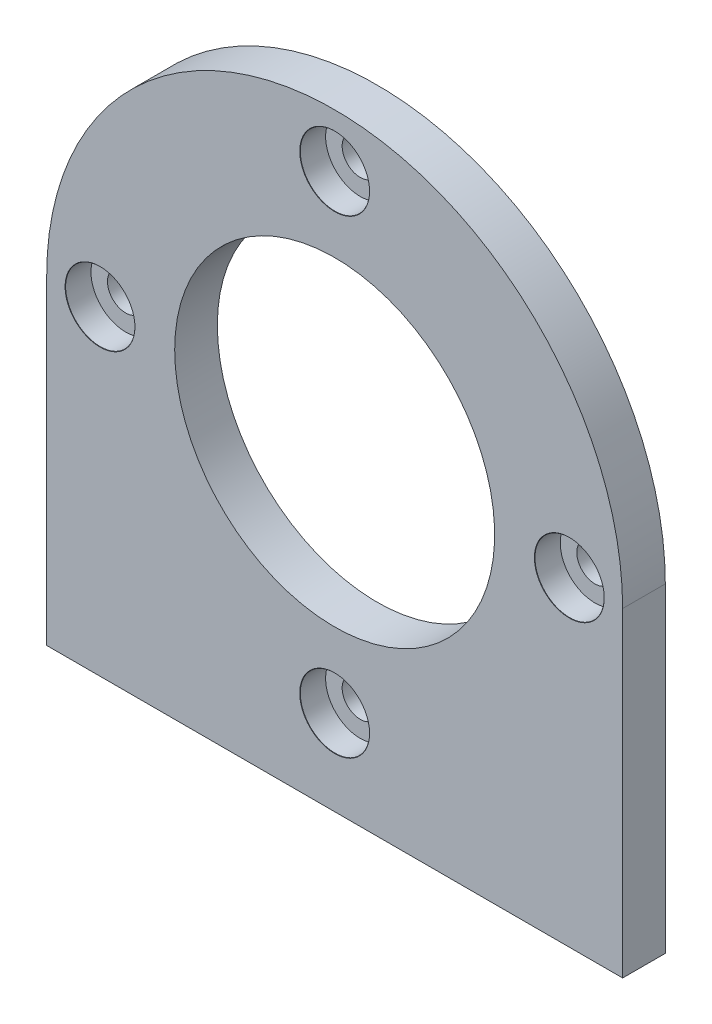
ISO-10303-21;
HEADER;
FILE_DESCRIPTION(('STEP AP214'),'2;1');
FILE_NAME('part.step','',(''),(''),'','','');
FILE_SCHEMA(('AUTOMOTIVE_DESIGN { 1 0 10303 214 1 1 1 1 }'));
ENDSEC;
DATA;
#1=APPLICATION_CONTEXT('core data for automotive mechanical design processes');
#2=APPLICATION_PROTOCOL_DEFINITION('international standard','automotive_design',2000,#1);
#3=PRODUCT_CONTEXT('',#1,'mechanical');
#4=PRODUCT('Part','Part','',(#3));
#5=PRODUCT_RELATED_PRODUCT_CATEGORY('part','',(#4));
#6=PRODUCT_DEFINITION_FORMATION('','',#4);
#7=PRODUCT_DEFINITION_CONTEXT('part definition',#1,'design');
#8=PRODUCT_DEFINITION('design','',#6,#7);
#9=PRODUCT_DEFINITION_SHAPE('','',#8);
#10=(LENGTH_UNIT() NAMED_UNIT(*) SI_UNIT(.MILLI.,.METRE.));
#11=(NAMED_UNIT(*) PLANE_ANGLE_UNIT() SI_UNIT($,.RADIAN.));
#12=(NAMED_UNIT(*) SI_UNIT($,.STERADIAN.) SOLID_ANGLE_UNIT());
#13=UNCERTAINTY_MEASURE_WITH_UNIT(LENGTH_MEASURE(1.E-05),#10,'distance_accuracy_value','');
#14=(GEOMETRIC_REPRESENTATION_CONTEXT(3) GLOBAL_UNCERTAINTY_ASSIGNED_CONTEXT((#13)) GLOBAL_UNIT_ASSIGNED_CONTEXT((#10,
#11,#12)) REPRESENTATION_CONTEXT('',''));
#15=CARTESIAN_POINT('',(0.,0.,0.));
#16=DIRECTION('',(0.,0.,1.));
#17=DIRECTION('',(1.,0.,0.));
#18=AXIS2_PLACEMENT_3D('',#15,#16,#17);
#19=CARTESIAN_POINT('',(0.,0.,4.));
#20=DIRECTION('',(0.,0.,-1.));
#21=DIRECTION('',(-1.,0.,0.));
#22=AXIS2_PLACEMENT_3D('',#19,#20,#21);
#23=CYLINDRICAL_SURFACE('',#22,27.);
#24=CARTESIAN_POINT('',(0.,0.,4.));
#25=DIRECTION('',(0.,0.,1.));
#26=DIRECTION('',(1.,0.,0.));
#27=AXIS2_PLACEMENT_3D('',#24,#25,#26);
#28=CIRCLE('',#27,27.);
#29=CARTESIAN_POINT('',(27.,0.,4.));
#30=VERTEX_POINT('',#29);
#31=CARTESIAN_POINT('',(-27.,0.,4.));
#32=VERTEX_POINT('',#31);
#33=EDGE_CURVE('E11',#30,#32,#28,.T.);
#34=ORIENTED_EDGE('',*,*,#33,.F.);
#35=DIRECTION('',(0.,0.,1.));
#36=VECTOR('',#35,1.);
#37=CARTESIAN_POINT('',(27.,0.,-61.773780845922));
#38=LINE('',#37,#36);
#39=CARTESIAN_POINT('',(27.,0.,0.));
#40=VERTEX_POINT('',#39);
#41=EDGE_CURVE('E120',#40,#30,#38,.T.);
#42=ORIENTED_EDGE('',*,*,#41,.F.);
#43=CARTESIAN_POINT('',(0.,0.,0.));
#44=DIRECTION('',(0.,0.,1.));
#45=DIRECTION('',(1.,0.,0.));
#46=AXIS2_PLACEMENT_3D('',#43,#44,#45);
#47=CIRCLE('',#46,27.);
#48=CARTESIAN_POINT('',(-27.,0.,0.));
#49=VERTEX_POINT('',#48);
#50=EDGE_CURVE('E48',#40,#49,#47,.T.);
#51=ORIENTED_EDGE('',*,*,#50,.T.);
#52=DIRECTION('',(0.,0.,1.));
#53=VECTOR('',#52,1.);
#54=CARTESIAN_POINT('',(-27.,0.,-61.773780845922));
#55=LINE('',#54,#53);
#56=EDGE_CURVE('E60',#49,#32,#55,.T.);
#57=ORIENTED_EDGE('',*,*,#56,.T.);
#58=EDGE_LOOP('',(#34,#42,#51,#57));
#59=FACE_BOUND('',#58,.T.);
#60=ADVANCED_FACE('F45',(#59),#23,.T.);
#61=CARTESIAN_POINT('',(0.,0.,4.));
#62=DIRECTION('',(0.,0.,1.));
#63=DIRECTION('',(1.,0.,0.));
#64=AXIS2_PLACEMENT_3D('',#61,#62,#63);
#65=PLANE('',#64);
#66=CARTESIAN_POINT('',(0.,0.,4.));
#67=DIRECTION('',(0.,0.,-1.));
#68=DIRECTION('',(-1.,0.,0.));
#69=AXIS2_PLACEMENT_3D('',#66,#67,#68);
#70=CIRCLE('',#69,15.);
#71=CARTESIAN_POINT('',(-15.,0.,4.));
#72=VERTEX_POINT('',#71);
#73=EDGE_CURVE('E108',#72,#72,#70,.T.);
#74=ORIENTED_EDGE('',*,*,#73,.T.);
#75=EDGE_LOOP('',(#74));
#76=FACE_BOUND('',#75,.T.);
#77=CARTESIAN_POINT('',(0.,22.,4.));
#78=DIRECTION('',(0.,0.,1.));
#79=DIRECTION('',(1.,0.,0.));
#80=AXIS2_PLACEMENT_3D('',#77,#78,#79);
#81=CIRCLE('',#80,3.275);
#82=CARTESIAN_POINT('',(3.275,22.,4.));
#83=VERTEX_POINT('',#82);
#84=EDGE_CURVE('E130',#83,#83,#81,.T.);
#85=ORIENTED_EDGE('',*,*,#84,.F.);
#86=EDGE_LOOP('',(#85));
#87=FACE_BOUND('',#86,.T.);
#88=CARTESIAN_POINT('',(22.0000000000006,6.21236273031702E-13,4.));
#89=DIRECTION('',(0.,0.,1.));
#90=DIRECTION('',(1.,0.,0.));
#91=AXIS2_PLACEMENT_3D('',#88,#89,#90);
#92=CIRCLE('',#91,3.275);
#93=CARTESIAN_POINT('',(25.2750000000006,6.21236273031702E-13,4.));
#94=VERTEX_POINT('',#93);
#95=EDGE_CURVE('E150',#94,#94,#92,.T.);
#96=ORIENTED_EDGE('',*,*,#95,.F.);
#97=EDGE_LOOP('',(#96));
#98=FACE_BOUND('',#97,.T.);
#99=CARTESIAN_POINT('',(1.2424725460634E-12,-22.,4.));
#100=DIRECTION('',(0.,0.,1.));
#101=DIRECTION('',(1.,0.,0.));
#102=AXIS2_PLACEMENT_3D('',#99,#100,#101);
#103=CIRCLE('',#102,3.275);
#104=CARTESIAN_POINT('',(3.27500000000124,-22.,4.));
#105=VERTEX_POINT('',#104);
#106=EDGE_CURVE('E170',#105,#105,#103,.T.);
#107=ORIENTED_EDGE('',*,*,#106,.F.);
#108=EDGE_LOOP('',(#107));
#109=FACE_BOUND('',#108,.T.);
#110=CARTESIAN_POINT('',(-21.9999999999994,-6.18542050073578E-13,4.));
#111=DIRECTION('',(0.,0.,1.));
#112=DIRECTION('',(1.,0.,0.));
#113=AXIS2_PLACEMENT_3D('',#110,#111,#112);
#114=CIRCLE('',#113,3.275);
#115=CARTESIAN_POINT('',(-18.7249999999994,-6.18542050073578E-13,4.));
#116=VERTEX_POINT('',#115);
#117=EDGE_CURVE('E190',#116,#116,#114,.T.);
#118=ORIENTED_EDGE('',*,*,#117,.F.);
#119=EDGE_LOOP('',(#118));
#120=FACE_BOUND('',#119,.T.);
#121=ORIENTED_EDGE('',*,*,#33,.T.);
#122=DIRECTION('',(0.,-1.,0.));
#123=VECTOR('',#122,1.);
#124=CARTESIAN_POINT('',(-27.,0.,4.));
#125=LINE('',#124,#123);
#126=CARTESIAN_POINT('',(-27.,-30.,4.));
#127=VERTEX_POINT('',#126);
#128=EDGE_CURVE('E88',#32,#127,#125,.T.);
#129=ORIENTED_EDGE('',*,*,#128,.T.);
#130=DIRECTION('',(1.,0.,0.));
#131=VECTOR('',#130,1.);
#132=CARTESIAN_POINT('',(-27.,-30.,4.));
#133=LINE('',#132,#131);
#134=CARTESIAN_POINT('',(27.,-30.,4.));
#135=VERTEX_POINT('',#134);
#136=EDGE_CURVE('E97',#127,#135,#133,.T.);
#137=ORIENTED_EDGE('',*,*,#136,.T.);
#138=DIRECTION('',(0.,1.,0.));
#139=VECTOR('',#138,1.);
#140=CARTESIAN_POINT('',(27.,-30.,4.));
#141=LINE('',#140,#139);
#142=EDGE_CURVE('E104',#135,#30,#141,.T.);
#143=ORIENTED_EDGE('',*,*,#142,.T.);
#144=EDGE_LOOP('',(#121,#129,#137,#143));
#145=FACE_BOUND('',#144,.T.);
#146=ADVANCED_FACE('F106',(#76,#87,#98,#109,#120,#145),#65,.T.);
#147=CARTESIAN_POINT('',(0.,0.,0.));
#148=DIRECTION('',(0.,0.,1.));
#149=DIRECTION('',(1.,0.,0.));
#150=AXIS2_PLACEMENT_3D('',#147,#148,#149);
#151=PLANE('',#150);
#152=CARTESIAN_POINT('',(0.,0.,0.));
#153=DIRECTION('',(0.,0.,-1.));
#154=DIRECTION('',(-1.,0.,0.));
#155=AXIS2_PLACEMENT_3D('',#152,#153,#154);
#156=CIRCLE('',#155,15.);
#157=CARTESIAN_POINT('',(-15.,0.,0.));
#158=VERTEX_POINT('',#157);
#159=EDGE_CURVE('E112',#158,#158,#156,.T.);
#160=ORIENTED_EDGE('',*,*,#159,.F.);
#161=EDGE_LOOP('',(#160));
#162=FACE_BOUND('',#161,.T.);
#163=CARTESIAN_POINT('',(0.,22.,0.));
#164=DIRECTION('',(0.,0.,1.));
#165=DIRECTION('',(1.,0.,0.));
#166=AXIS2_PLACEMENT_3D('',#163,#164,#165);
#167=CIRCLE('',#166,1.7);
#168=CARTESIAN_POINT('',(1.7,22.,0.));
#169=VERTEX_POINT('',#168);
#170=EDGE_CURVE('E146',#169,#169,#167,.T.);
#171=ORIENTED_EDGE('',*,*,#170,.T.);
#172=EDGE_LOOP('',(#171));
#173=FACE_BOUND('',#172,.T.);
#174=CARTESIAN_POINT('',(22.0000000000006,6.21236273031702E-13,0.));
#175=DIRECTION('',(0.,0.,1.));
#176=DIRECTION('',(1.,0.,0.));
#177=AXIS2_PLACEMENT_3D('',#174,#175,#176);
#178=CIRCLE('',#177,1.7);
#179=CARTESIAN_POINT('',(23.7000000000006,6.21236273031702E-13,0.));
#180=VERTEX_POINT('',#179);
#181=EDGE_CURVE('E166',#180,#180,#178,.T.);
#182=ORIENTED_EDGE('',*,*,#181,.T.);
#183=EDGE_LOOP('',(#182));
#184=FACE_BOUND('',#183,.T.);
#185=CARTESIAN_POINT('',(1.2424725460634E-12,-22.,0.));
#186=DIRECTION('',(0.,0.,1.));
#187=DIRECTION('',(1.,0.,0.));
#188=AXIS2_PLACEMENT_3D('',#185,#186,#187);
#189=CIRCLE('',#188,1.7);
#190=CARTESIAN_POINT('',(1.70000000000124,-22.,0.));
#191=VERTEX_POINT('',#190);
#192=EDGE_CURVE('E186',#191,#191,#189,.T.);
#193=ORIENTED_EDGE('',*,*,#192,.T.);
#194=EDGE_LOOP('',(#193));
#195=FACE_BOUND('',#194,.T.);
#196=CARTESIAN_POINT('',(-21.9999999999994,-6.18542050073578E-13,0.));
#197=DIRECTION('',(0.,0.,1.));
#198=DIRECTION('',(1.,0.,0.));
#199=AXIS2_PLACEMENT_3D('',#196,#197,#198);
#200=CIRCLE('',#199,1.7);
#201=CARTESIAN_POINT('',(-20.2999999999994,-6.18542050073578E-13,0.));
#202=VERTEX_POINT('',#201);
#203=EDGE_CURVE('E206',#202,#202,#200,.T.);
#204=ORIENTED_EDGE('',*,*,#203,.T.);
#205=EDGE_LOOP('',(#204));
#206=FACE_BOUND('',#205,.T.);
#207=ORIENTED_EDGE('',*,*,#50,.F.);
#208=DIRECTION('',(0.,-1.,0.));
#209=VECTOR('',#208,1.);
#210=CARTESIAN_POINT('',(27.,-30.,0.));
#211=LINE('',#210,#209);
#212=CARTESIAN_POINT('',(27.,-30.,0.));
#213=VERTEX_POINT('',#212);
#214=EDGE_CURVE('E115',#40,#213,#211,.T.);
#215=ORIENTED_EDGE('',*,*,#214,.T.);
#216=DIRECTION('',(-1.,0.,0.));
#217=VECTOR('',#216,1.);
#218=CARTESIAN_POINT('',(-27.,-30.,0.));
#219=LINE('',#218,#217);
#220=CARTESIAN_POINT('',(-27.,-30.,0.));
#221=VERTEX_POINT('',#220);
#222=EDGE_CURVE('E123',#213,#221,#219,.T.);
#223=ORIENTED_EDGE('',*,*,#222,.T.);
#224=DIRECTION('',(0.,1.,0.));
#225=VECTOR('',#224,1.);
#226=CARTESIAN_POINT('',(-27.,0.,0.));
#227=LINE('',#226,#225);
#228=EDGE_CURVE('E90',#221,#49,#227,.T.);
#229=ORIENTED_EDGE('',*,*,#228,.T.);
#230=EDGE_LOOP('',(#207,#215,#223,#229));
#231=FACE_BOUND('',#230,.T.);
#232=ADVANCED_FACE('F214',(#162,#173,#184,#195,#206,#231),#151,.F.);
#233=CARTESIAN_POINT('',(-21.9999999999994,-6.18542050073578E-13,4.));
#234=DIRECTION('',(0.,0.,1.));
#235=DIRECTION('',(1.,0.,0.));
#236=AXIS2_PLACEMENT_3D('',#233,#234,#235);
#237=CYLINDRICAL_SURFACE('',#236,1.7);
#238=ORIENTED_EDGE('',*,*,#203,.F.);
#239=EDGE_LOOP('',(#238));
#240=FACE_BOUND('',#239,.T.);
#241=CARTESIAN_POINT('',(-21.9999999999994,-6.18542050073578E-13,1.6));
#242=DIRECTION('',(0.,0.,1.));
#243=DIRECTION('',(1.,0.,0.));
#244=AXIS2_PLACEMENT_3D('',#241,#242,#243);
#245=CIRCLE('',#244,1.7);
#246=CARTESIAN_POINT('',(-20.2999999999994,-6.18542050073578E-13,1.6));
#247=VERTEX_POINT('',#246);
#248=EDGE_CURVE('E202',#247,#247,#245,.T.);
#249=ORIENTED_EDGE('',*,*,#248,.T.);
#250=EDGE_LOOP('',(#249));
#251=FACE_BOUND('',#250,.T.);
#252=ADVANCED_FACE('F226',(#240,#251),#237,.F.);
#253=CARTESIAN_POINT('',(-18.7499999999994,-6.18542050073578E-13,1.6));
#254=DIRECTION('',(0.,0.,-1.));
#255=DIRECTION('',(-1.,0.,0.));
#256=AXIS2_PLACEMENT_3D('',#253,#254,#255);
#257=PLANE('',#256);
#258=ORIENTED_EDGE('',*,*,#248,.F.);
#259=EDGE_LOOP('',(#258));
#260=FACE_BOUND('',#259,.T.);
#261=CARTESIAN_POINT('',(-21.9999999999994,-6.18542050073578E-13,1.6));
#262=DIRECTION('',(0.,0.,1.));
#263=DIRECTION('',(1.,0.,0.));
#264=AXIS2_PLACEMENT_3D('',#261,#262,#263);
#265=CIRCLE('',#264,3.25);
#266=CARTESIAN_POINT('',(-18.7499999999994,-6.18542050073578E-13,1.6));
#267=VERTEX_POINT('',#266);
#268=EDGE_CURVE('E198',#267,#267,#265,.T.);
#269=ORIENTED_EDGE('',*,*,#268,.T.);
#270=EDGE_LOOP('',(#269));
#271=FACE_BOUND('',#270,.T.);
#272=ADVANCED_FACE('F272',(#260,#271),#257,.F.);
#273=CARTESIAN_POINT('',(-21.9999999999994,-6.18542050073578E-13,4.));
#274=DIRECTION('',(0.,0.,1.));
#275=DIRECTION('',(1.,0.,0.));
#276=AXIS2_PLACEMENT_3D('',#273,#274,#275);
#277=CYLINDRICAL_SURFACE('',#276,3.25);
#278=ORIENTED_EDGE('',*,*,#268,.F.);
#279=EDGE_LOOP('',(#278));
#280=FACE_BOUND('',#279,.T.);
#281=CARTESIAN_POINT('',(-21.9999999999994,-6.18542050073578E-13,3.975));
#282=DIRECTION('',(0.,0.,1.));
#283=DIRECTION('',(1.,0.,0.));
#284=AXIS2_PLACEMENT_3D('',#281,#282,#283);
#285=CIRCLE('',#284,3.25);
#286=CARTESIAN_POINT('',(-18.7499999999994,-6.18542050073578E-13,3.975));
#287=VERTEX_POINT('',#286);
#288=EDGE_CURVE('E194',#287,#287,#285,.T.);
#289=ORIENTED_EDGE('',*,*,#288,.T.);
#290=EDGE_LOOP('',(#289));
#291=FACE_BOUND('',#290,.T.);
#292=ADVANCED_FACE('F266',(#280,#291),#277,.F.);
#293=CARTESIAN_POINT('',(-21.9999999999994,-6.18542050073578E-13,4.));
#294=DIRECTION('',(0.,0.,1.));
#295=DIRECTION('',(1.,0.,0.));
#296=AXIS2_PLACEMENT_3D('',#293,#294,#295);
#297=CONICAL_SURFACE('',#296,3.275,0.785398163397448);
#298=ORIENTED_EDGE('',*,*,#288,.F.);
#299=EDGE_LOOP('',(#298));
#300=FACE_BOUND('',#299,.T.);
#301=ORIENTED_EDGE('',*,*,#117,.T.);
#302=EDGE_LOOP('',(#301));
#303=FACE_BOUND('',#302,.T.);
#304=ADVANCED_FACE('F237',(#300,#303),#297,.F.);
#305=CARTESIAN_POINT('',(1.2424725460634E-12,-22.,4.));
#306=DIRECTION('',(0.,0.,1.));
#307=DIRECTION('',(1.,0.,0.));
#308=AXIS2_PLACEMENT_3D('',#305,#306,#307);
#309=CYLINDRICAL_SURFACE('',#308,1.7);
#310=ORIENTED_EDGE('',*,*,#192,.F.);
#311=EDGE_LOOP('',(#310));
#312=FACE_BOUND('',#311,.T.);
#313=CARTESIAN_POINT('',(1.2424725460634E-12,-22.,1.6));
#314=DIRECTION('',(0.,0.,1.));
#315=DIRECTION('',(1.,0.,0.));
#316=AXIS2_PLACEMENT_3D('',#313,#314,#315);
#317=CIRCLE('',#316,1.7);
#318=CARTESIAN_POINT('',(1.70000000000124,-22.,1.6));
#319=VERTEX_POINT('',#318);
#320=EDGE_CURVE('E182',#319,#319,#317,.T.);
#321=ORIENTED_EDGE('',*,*,#320,.T.);
#322=EDGE_LOOP('',(#321));
#323=FACE_BOUND('',#322,.T.);
#324=ADVANCED_FACE('F233',(#312,#323),#309,.F.);
#325=CARTESIAN_POINT('',(3.25000000000124,-22.,1.6));
#326=DIRECTION('',(0.,0.,-1.));
#327=DIRECTION('',(-1.,0.,0.));
#328=AXIS2_PLACEMENT_3D('',#325,#326,#327);
#329=PLANE('',#328);
#330=ORIENTED_EDGE('',*,*,#320,.F.);
#331=EDGE_LOOP('',(#330));
#332=FACE_BOUND('',#331,.T.);
#333=CARTESIAN_POINT('',(1.2424725460634E-12,-22.,1.6));
#334=DIRECTION('',(0.,0.,1.));
#335=DIRECTION('',(1.,0.,0.));
#336=AXIS2_PLACEMENT_3D('',#333,#334,#335);
#337=CIRCLE('',#336,3.25);
#338=CARTESIAN_POINT('',(3.25000000000124,-22.,1.6));
#339=VERTEX_POINT('',#338);
#340=EDGE_CURVE('E178',#339,#339,#337,.T.);
#341=ORIENTED_EDGE('',*,*,#340,.T.);
#342=EDGE_LOOP('',(#341));
#343=FACE_BOUND('',#342,.T.);
#344=ADVANCED_FACE('F236',(#332,#343),#329,.F.);
#345=CARTESIAN_POINT('',(1.2424725460634E-12,-22.,4.));
#346=DIRECTION('',(0.,0.,1.));
#347=DIRECTION('',(1.,0.,0.));
#348=AXIS2_PLACEMENT_3D('',#345,#346,#347);
#349=CYLINDRICAL_SURFACE('',#348,3.25);
#350=ORIENTED_EDGE('',*,*,#340,.F.);
#351=EDGE_LOOP('',(#350));
#352=FACE_BOUND('',#351,.T.);
#353=CARTESIAN_POINT('',(1.2424725460634E-12,-22.,3.975));
#354=DIRECTION('',(0.,0.,1.));
#355=DIRECTION('',(1.,0.,0.));
#356=AXIS2_PLACEMENT_3D('',#353,#354,#355);
#357=CIRCLE('',#356,3.25);
#358=CARTESIAN_POINT('',(3.25000000000124,-22.,3.975));
#359=VERTEX_POINT('',#358);
#360=EDGE_CURVE('E174',#359,#359,#357,.T.);
#361=ORIENTED_EDGE('',*,*,#360,.T.);
#362=EDGE_LOOP('',(#361));
#363=FACE_BOUND('',#362,.T.);
#364=ADVANCED_FACE('F243',(#352,#363),#349,.F.);
#365=CARTESIAN_POINT('',(1.2424725460634E-12,-22.,4.));
#366=DIRECTION('',(0.,0.,1.));
#367=DIRECTION('',(1.,0.,0.));
#368=AXIS2_PLACEMENT_3D('',#365,#366,#367);
#369=CONICAL_SURFACE('',#368,3.275,0.785398163397448);
#370=ORIENTED_EDGE('',*,*,#360,.F.);
#371=EDGE_LOOP('',(#370));
#372=FACE_BOUND('',#371,.T.);
#373=ORIENTED_EDGE('',*,*,#106,.T.);
#374=EDGE_LOOP('',(#373));
#375=FACE_BOUND('',#374,.T.);
#376=ADVANCED_FACE('F249',(#372,#375),#369,.F.);
#377=CARTESIAN_POINT('',(22.0000000000006,6.21236273031702E-13,4.));
#378=DIRECTION('',(0.,0.,1.));
#379=DIRECTION('',(1.,0.,0.));
#380=AXIS2_PLACEMENT_3D('',#377,#378,#379);
#381=CYLINDRICAL_SURFACE('',#380,1.7);
#382=ORIENTED_EDGE('',*,*,#181,.F.);
#383=EDGE_LOOP('',(#382));
#384=FACE_BOUND('',#383,.T.);
#385=CARTESIAN_POINT('',(22.0000000000006,6.21236273031702E-13,1.6));
#386=DIRECTION('',(0.,0.,1.));
#387=DIRECTION('',(1.,0.,0.));
#388=AXIS2_PLACEMENT_3D('',#385,#386,#387);
#389=CIRCLE('',#388,1.7);
#390=CARTESIAN_POINT('',(23.7000000000006,6.21236273031702E-13,1.6));
#391=VERTEX_POINT('',#390);
#392=EDGE_CURVE('E162',#391,#391,#389,.T.);
#393=ORIENTED_EDGE('',*,*,#392,.T.);
#394=EDGE_LOOP('',(#393));
#395=FACE_BOUND('',#394,.T.);
#396=ADVANCED_FACE('F255',(#384,#395),#381,.F.);
#397=CARTESIAN_POINT('',(25.2500000000006,6.21236273031702E-13,1.6));
#398=DIRECTION('',(0.,0.,-1.));
#399=DIRECTION('',(-1.,0.,0.));
#400=AXIS2_PLACEMENT_3D('',#397,#398,#399);
#401=PLANE('',#400);
#402=ORIENTED_EDGE('',*,*,#392,.F.);
#403=EDGE_LOOP('',(#402));
#404=FACE_BOUND('',#403,.T.);
#405=CARTESIAN_POINT('',(22.0000000000006,6.21236273031702E-13,1.6));
#406=DIRECTION('',(0.,0.,1.));
#407=DIRECTION('',(1.,0.,0.));
#408=AXIS2_PLACEMENT_3D('',#405,#406,#407);
#409=CIRCLE('',#408,3.25);
#410=CARTESIAN_POINT('',(25.2500000000006,6.21236273031702E-13,1.6));
#411=VERTEX_POINT('',#410);
#412=EDGE_CURVE('E158',#411,#411,#409,.T.);
#413=ORIENTED_EDGE('',*,*,#412,.T.);
#414=EDGE_LOOP('',(#413));
#415=FACE_BOUND('',#414,.T.);
#416=ADVANCED_FACE('F379',(#404,#415),#401,.F.);
#417=CARTESIAN_POINT('',(22.0000000000006,6.21236273031702E-13,4.));
#418=DIRECTION('',(0.,0.,1.));
#419=DIRECTION('',(1.,0.,0.));
#420=AXIS2_PLACEMENT_3D('',#417,#418,#419);
#421=CYLINDRICAL_SURFACE('',#420,3.25);
#422=ORIENTED_EDGE('',*,*,#412,.F.);
#423=EDGE_LOOP('',(#422));
#424=FACE_BOUND('',#423,.T.);
#425=CARTESIAN_POINT('',(22.0000000000006,6.21236273031702E-13,3.975));
#426=DIRECTION('',(0.,0.,1.));
#427=DIRECTION('',(1.,0.,0.));
#428=AXIS2_PLACEMENT_3D('',#425,#426,#427);
#429=CIRCLE('',#428,3.25);
#430=CARTESIAN_POINT('',(25.2500000000006,6.21236273031702E-13,3.975));
#431=VERTEX_POINT('',#430);
#432=EDGE_CURVE('E154',#431,#431,#429,.T.);
#433=ORIENTED_EDGE('',*,*,#432,.T.);
#434=EDGE_LOOP('',(#433));
#435=FACE_BOUND('',#434,.T.);
#436=ADVANCED_FACE('F370',(#424,#435),#421,.F.);
#437=CARTESIAN_POINT('',(22.0000000000006,6.21236273031702E-13,4.));
#438=DIRECTION('',(0.,0.,1.));
#439=DIRECTION('',(1.,0.,0.));
#440=AXIS2_PLACEMENT_3D('',#437,#438,#439);
#441=CONICAL_SURFACE('',#440,3.275,0.785398163397448);
#442=ORIENTED_EDGE('',*,*,#432,.F.);
#443=EDGE_LOOP('',(#442));
#444=FACE_BOUND('',#443,.T.);
#445=ORIENTED_EDGE('',*,*,#95,.T.);
#446=EDGE_LOOP('',(#445));
#447=FACE_BOUND('',#446,.T.);
#448=ADVANCED_FACE('F361',(#444,#447),#441,.F.);
#449=CARTESIAN_POINT('',(0.,22.,4.));
#450=DIRECTION('',(0.,0.,1.));
#451=DIRECTION('',(1.,0.,0.));
#452=AXIS2_PLACEMENT_3D('',#449,#450,#451);
#453=CYLINDRICAL_SURFACE('',#452,1.7);
#454=ORIENTED_EDGE('',*,*,#170,.F.);
#455=EDGE_LOOP('',(#454));
#456=FACE_BOUND('',#455,.T.);
#457=CARTESIAN_POINT('',(0.,22.,1.6));
#458=DIRECTION('',(0.,0.,1.));
#459=DIRECTION('',(1.,0.,0.));
#460=AXIS2_PLACEMENT_3D('',#457,#458,#459);
#461=CIRCLE('',#460,1.7);
#462=CARTESIAN_POINT('',(1.7,22.,1.6));
#463=VERTEX_POINT('',#462);
#464=EDGE_CURVE('E142',#463,#463,#461,.T.);
#465=ORIENTED_EDGE('',*,*,#464,.T.);
#466=EDGE_LOOP('',(#465));
#467=FACE_BOUND('',#466,.T.);
#468=ADVANCED_FACE('F352',(#456,#467),#453,.F.);
#469=CARTESIAN_POINT('',(3.25,22.,1.6));
#470=DIRECTION('',(0.,0.,-1.));
#471=DIRECTION('',(-1.,0.,0.));
#472=AXIS2_PLACEMENT_3D('',#469,#470,#471);
#473=PLANE('',#472);
#474=ORIENTED_EDGE('',*,*,#464,.F.);
#475=EDGE_LOOP('',(#474));
#476=FACE_BOUND('',#475,.T.);
#477=CARTESIAN_POINT('',(0.,22.,1.6));
#478=DIRECTION('',(0.,0.,1.));
#479=DIRECTION('',(1.,0.,0.));
#480=AXIS2_PLACEMENT_3D('',#477,#478,#479);
#481=CIRCLE('',#480,3.25);
#482=CARTESIAN_POINT('',(3.25,22.,1.6));
#483=VERTEX_POINT('',#482);
#484=EDGE_CURVE('E138',#483,#483,#481,.T.);
#485=ORIENTED_EDGE('',*,*,#484,.T.);
#486=EDGE_LOOP('',(#485));
#487=FACE_BOUND('',#486,.T.);
#488=ADVANCED_FACE('F343',(#476,#487),#473,.F.);
#489=CARTESIAN_POINT('',(0.,22.,4.));
#490=DIRECTION('',(0.,0.,1.));
#491=DIRECTION('',(1.,0.,0.));
#492=AXIS2_PLACEMENT_3D('',#489,#490,#491);
#493=CYLINDRICAL_SURFACE('',#492,3.25);
#494=ORIENTED_EDGE('',*,*,#484,.F.);
#495=EDGE_LOOP('',(#494));
#496=FACE_BOUND('',#495,.T.);
#497=CARTESIAN_POINT('',(0.,22.,3.975));
#498=DIRECTION('',(0.,0.,1.));
#499=DIRECTION('',(1.,0.,0.));
#500=AXIS2_PLACEMENT_3D('',#497,#498,#499);
#501=CIRCLE('',#500,3.25);
#502=CARTESIAN_POINT('',(3.25,22.,3.975));
#503=VERTEX_POINT('',#502);
#504=EDGE_CURVE('E134',#503,#503,#501,.T.);
#505=ORIENTED_EDGE('',*,*,#504,.T.);
#506=EDGE_LOOP('',(#505));
#507=FACE_BOUND('',#506,.T.);
#508=ADVANCED_FACE('F335',(#496,#507),#493,.F.);
#509=CARTESIAN_POINT('',(0.,22.,4.));
#510=DIRECTION('',(0.,0.,1.));
#511=DIRECTION('',(1.,0.,0.));
#512=AXIS2_PLACEMENT_3D('',#509,#510,#511);
#513=CONICAL_SURFACE('',#512,3.275,0.785398163397448);
#514=ORIENTED_EDGE('',*,*,#504,.F.);
#515=EDGE_LOOP('',(#514));
#516=FACE_BOUND('',#515,.T.);
#517=ORIENTED_EDGE('',*,*,#84,.T.);
#518=EDGE_LOOP('',(#517));
#519=FACE_BOUND('',#518,.T.);
#520=ADVANCED_FACE('F285',(#516,#519),#513,.F.);
#521=CARTESIAN_POINT('',(27.,-30.,-61.773780845922));
#522=DIRECTION('',(1.,0.,0.));
#523=DIRECTION('',(0.,0.,-1.));
#524=AXIS2_PLACEMENT_3D('',#521,#522,#523);
#525=PLANE('',#524);
#526=ORIENTED_EDGE('',*,*,#214,.F.);
#527=ORIENTED_EDGE('',*,*,#41,.T.);
#528=ORIENTED_EDGE('',*,*,#142,.F.);
#529=DIRECTION('',(0.,0.,1.));
#530=VECTOR('',#529,1.);
#531=CARTESIAN_POINT('',(27.,-30.,-61.773780845922));
#532=LINE('',#531,#530);
#533=EDGE_CURVE('E94',#213,#135,#532,.T.);
#534=ORIENTED_EDGE('',*,*,#533,.F.);
#535=EDGE_LOOP('',(#526,#527,#528,#534));
#536=FACE_BOUND('',#535,.T.);
#537=ADVANCED_FACE('F289',(#536),#525,.T.);
#538=CARTESIAN_POINT('',(-27.,-30.,-61.773780845922));
#539=DIRECTION('',(0.,-1.,0.));
#540=DIRECTION('',(1.,0.,0.));
#541=AXIS2_PLACEMENT_3D('',#538,#539,#540);
#542=PLANE('',#541);
#543=ORIENTED_EDGE('',*,*,#222,.F.);
#544=ORIENTED_EDGE('',*,*,#533,.T.);
#545=ORIENTED_EDGE('',*,*,#136,.F.);
#546=DIRECTION('',(0.,0.,1.));
#547=VECTOR('',#546,1.);
#548=CARTESIAN_POINT('',(-27.,-30.,-61.773780845922));
#549=LINE('',#548,#547);
#550=EDGE_CURVE('E84',#221,#127,#549,.T.);
#551=ORIENTED_EDGE('',*,*,#550,.F.);
#552=EDGE_LOOP('',(#543,#544,#545,#551));
#553=FACE_BOUND('',#552,.T.);
#554=ADVANCED_FACE('F98',(#553),#542,.T.);
#555=CARTESIAN_POINT('',(-27.,0.,-61.773780845922));
#556=DIRECTION('',(-1.,0.,0.));
#557=DIRECTION('',(0.,-1.,0.));
#558=AXIS2_PLACEMENT_3D('',#555,#556,#557);
#559=PLANE('',#558);
#560=ORIENTED_EDGE('',*,*,#228,.F.);
#561=ORIENTED_EDGE('',*,*,#550,.T.);
#562=ORIENTED_EDGE('',*,*,#128,.F.);
#563=ORIENTED_EDGE('',*,*,#56,.F.);
#564=EDGE_LOOP('',(#560,#561,#562,#563));
#565=FACE_BOUND('',#564,.T.);
#566=ADVANCED_FACE('F86',(#565),#559,.T.);
#567=CARTESIAN_POINT('',(0.,0.,4.));
#568=DIRECTION('',(0.,0.,-1.));
#569=DIRECTION('',(-1.,0.,0.));
#570=AXIS2_PLACEMENT_3D('',#567,#568,#569);
#571=CYLINDRICAL_SURFACE('',#570,15.);
#572=ORIENTED_EDGE('',*,*,#73,.F.);
#573=EDGE_LOOP('',(#572));
#574=FACE_BOUND('',#573,.T.);
#575=ORIENTED_EDGE('',*,*,#159,.T.);
#576=EDGE_LOOP('',(#575));
#577=FACE_BOUND('',#576,.T.);
#578=ADVANCED_FACE('F222',(#574,#577),#571,.F.);
#579=CLOSED_SHELL('',(#60,#146,#232,#252,#272,#292,#304,#324,#344,#364,#376,#396,#416,#436,#448,
#468,#488,#508,#520,#537,#554,#566,#578));
#580=MANIFOLD_SOLID_BREP('B2',#579);
#581=ADVANCED_BREP_SHAPE_REPRESENTATION('',(#18,#580),#14);
#582=SHAPE_DEFINITION_REPRESENTATION(#9,#581);
ENDSEC;
END-ISO-10303-21;
